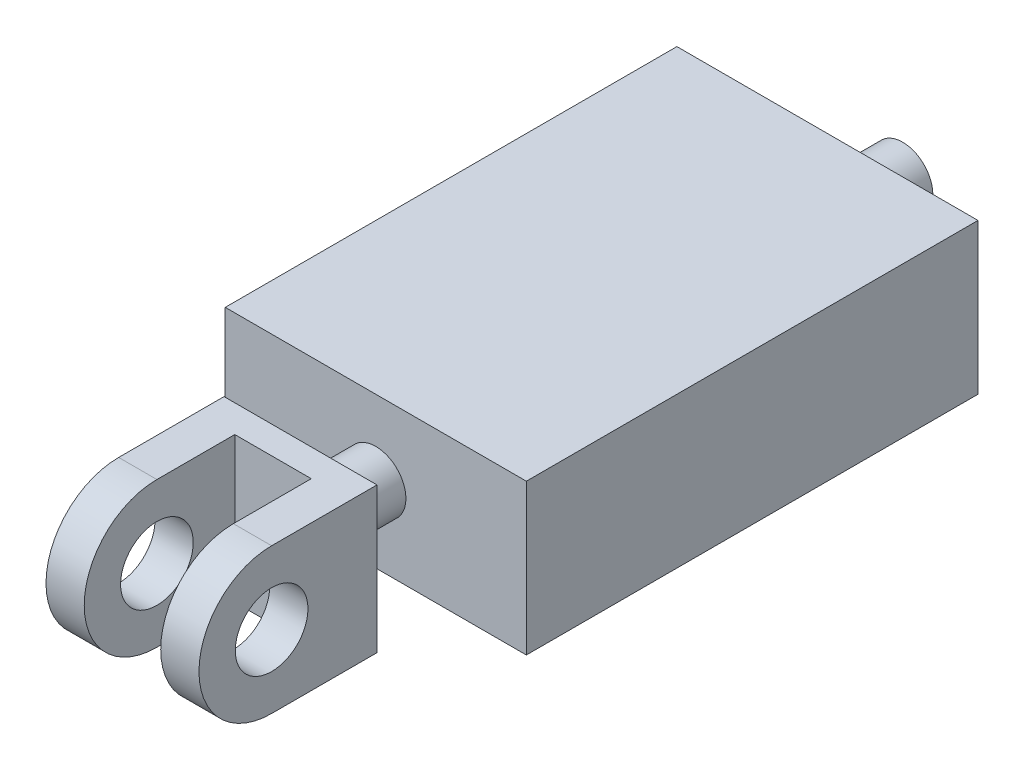
ISO-10303-21;
HEADER;
FILE_DESCRIPTION(('STEP AP214'),'2;1');
FILE_NAME('part.step','',(''),(''),'','','');
FILE_SCHEMA(('AUTOMOTIVE_DESIGN { 1 0 10303 214 1 1 1 1 }'));
ENDSEC;
DATA;
#1=APPLICATION_CONTEXT('core data for automotive mechanical design processes');
#2=APPLICATION_PROTOCOL_DEFINITION('international standard','automotive_design',2000,#1);
#3=PRODUCT_CONTEXT('',#1,'mechanical');
#4=PRODUCT('Part','Part','',(#3));
#5=PRODUCT_RELATED_PRODUCT_CATEGORY('part','',(#4));
#6=PRODUCT_DEFINITION_FORMATION('','',#4);
#7=PRODUCT_DEFINITION_CONTEXT('part definition',#1,'design');
#8=PRODUCT_DEFINITION('design','',#6,#7);
#9=PRODUCT_DEFINITION_SHAPE('','',#8);
#10=(LENGTH_UNIT() NAMED_UNIT(*) SI_UNIT(.MILLI.,.METRE.));
#11=(NAMED_UNIT(*) PLANE_ANGLE_UNIT() SI_UNIT($,.RADIAN.));
#12=(NAMED_UNIT(*) SI_UNIT($,.STERADIAN.) SOLID_ANGLE_UNIT());
#13=UNCERTAINTY_MEASURE_WITH_UNIT(LENGTH_MEASURE(1.E-05),#10,'distance_accuracy_value','');
#14=(GEOMETRIC_REPRESENTATION_CONTEXT(3) GLOBAL_UNCERTAINTY_ASSIGNED_CONTEXT((#13)) GLOBAL_UNIT_ASSIGNED_CONTEXT((#10,
#11,#12)) REPRESENTATION_CONTEXT('',''));
#15=CARTESIAN_POINT('',(0.,0.,0.));
#16=DIRECTION('',(0.,0.,1.));
#17=DIRECTION('',(1.,0.,0.));
#18=AXIS2_PLACEMENT_3D('',#15,#16,#17);
#19=CARTESIAN_POINT('',(-5.08,5.,27.));
#20=DIRECTION('',(1.,0.,0.));
#21=DIRECTION('',(0.,0.,-1.));
#22=AXIS2_PLACEMENT_3D('',#19,#20,#21);
#23=CYLINDRICAL_SURFACE('',#22,4.826);
#24=CARTESIAN_POINT('',(2.54,5.,27.));
#25=DIRECTION('',(1.,0.,0.));
#26=DIRECTION('',(0.,0.,-1.));
#27=AXIS2_PLACEMENT_3D('',#24,#25,#26);
#28=CIRCLE('',#27,4.826);
#29=CARTESIAN_POINT('',(2.54,0.173999999999997,27.));
#30=VERTEX_POINT('',#29);
#31=CARTESIAN_POINT('',(2.54,9.82600000000003,27.));
#32=VERTEX_POINT('',#31);
#33=EDGE_CURVE('E185',#30,#32,#28,.F.);
#34=ORIENTED_EDGE('',*,*,#33,.F.);
#35=DIRECTION('',(1.,0.,0.));
#36=VECTOR('',#35,1.);
#37=CARTESIAN_POINT('',(-5.08,0.173999999999997,27.));
#38=LINE('',#37,#36);
#39=CARTESIAN_POINT('',(5.08,0.173999999999997,27.));
#40=VERTEX_POINT('',#39);
#41=EDGE_CURVE('E227',#30,#40,#38,.T.);
#42=ORIENTED_EDGE('',*,*,#41,.T.);
#43=CARTESIAN_POINT('',(5.08,5.,27.));
#44=DIRECTION('',(1.,0.,0.));
#45=DIRECTION('',(0.,0.,-1.));
#46=AXIS2_PLACEMENT_3D('',#43,#44,#45);
#47=CIRCLE('',#46,4.826);
#48=CARTESIAN_POINT('',(5.08,9.826,27.));
#49=VERTEX_POINT('',#48);
#50=EDGE_CURVE('E192',#49,#40,#47,.T.);
#51=ORIENTED_EDGE('',*,*,#50,.F.);
#52=DIRECTION('',(1.,0.,0.));
#53=VECTOR('',#52,1.);
#54=CARTESIAN_POINT('',(-5.08,9.826,27.));
#55=LINE('',#54,#53);
#56=EDGE_CURVE('E231',#32,#49,#55,.T.);
#57=ORIENTED_EDGE('',*,*,#56,.F.);
#58=EDGE_LOOP('',(#34,#42,#51,#57));
#59=FACE_BOUND('',#58,.T.);
#60=ADVANCED_FACE('F45',(#59),#23,.T.);
#61=CARTESIAN_POINT('',(-5.08,5.,27.));
#62=DIRECTION('',(1.,0.,0.));
#63=DIRECTION('',(0.,0.,-1.));
#64=AXIS2_PLACEMENT_3D('',#61,#62,#63);
#65=CYLINDRICAL_SURFACE('',#64,2.413);
#66=CARTESIAN_POINT('',(2.54,5.,27.));
#67=DIRECTION('',(1.,0.,0.));
#68=DIRECTION('',(0.,0.,-1.));
#69=AXIS2_PLACEMENT_3D('',#66,#67,#68);
#70=CIRCLE('',#69,2.413);
#71=CARTESIAN_POINT('',(2.54,5.,24.587));
#72=VERTEX_POINT('',#71);
#73=EDGE_CURVE('E180',#72,#72,#70,.F.);
#74=ORIENTED_EDGE('',*,*,#73,.T.);
#75=EDGE_LOOP('',(#74));
#76=FACE_BOUND('',#75,.T.);
#77=CARTESIAN_POINT('',(5.08,5.,27.));
#78=DIRECTION('',(1.,0.,0.));
#79=DIRECTION('',(0.,0.,-1.));
#80=AXIS2_PLACEMENT_3D('',#77,#78,#79);
#81=CIRCLE('',#80,2.413);
#82=CARTESIAN_POINT('',(5.08,5.,24.587));
#83=VERTEX_POINT('',#82);
#84=EDGE_CURVE('E188',#83,#83,#81,.T.);
#85=ORIENTED_EDGE('',*,*,#84,.T.);
#86=EDGE_LOOP('',(#85));
#87=FACE_BOUND('',#86,.T.);
#88=ADVANCED_FACE('F297',(#76,#87),#65,.F.);
#89=CARTESIAN_POINT('',(-10.,10.,15.));
#90=DIRECTION('',(1.,0.,0.));
#91=DIRECTION('',(0.,0.,-1.));
#92=AXIS2_PLACEMENT_3D('',#89,#90,#91);
#93=PLANE('',#92);
#94=DIRECTION('',(0.,0.,1.));
#95=VECTOR('',#94,1.);
#96=CARTESIAN_POINT('',(-10.,0.,15.));
#97=LINE('',#96,#95);
#98=CARTESIAN_POINT('',(-10.,0.,-15.));
#99=VERTEX_POINT('',#98);
#100=CARTESIAN_POINT('',(-10.,0.,15.));
#101=VERTEX_POINT('',#100);
#102=EDGE_CURVE('E254',#99,#101,#97,.T.);
#103=ORIENTED_EDGE('',*,*,#102,.T.);
#104=DIRECTION('',(0.,-1.,0.));
#105=VECTOR('',#104,1.);
#106=CARTESIAN_POINT('',(-10.,10.,15.));
#107=LINE('',#106,#105);
#108=CARTESIAN_POINT('',(-10.,10.,15.));
#109=VERTEX_POINT('',#108);
#110=EDGE_CURVE('E54',#109,#101,#107,.T.);
#111=ORIENTED_EDGE('',*,*,#110,.F.);
#112=DIRECTION('',(0.,0.,1.));
#113=VECTOR('',#112,1.);
#114=CARTESIAN_POINT('',(-10.,10.,15.));
#115=LINE('',#114,#113);
#116=CARTESIAN_POINT('',(-10.,10.,-15.));
#117=VERTEX_POINT('',#116);
#118=EDGE_CURVE('E255',#117,#109,#115,.T.);
#119=ORIENTED_EDGE('',*,*,#118,.F.);
#120=DIRECTION('',(0.,-1.,0.));
#121=VECTOR('',#120,1.);
#122=CARTESIAN_POINT('',(-10.,10.,-15.));
#123=LINE('',#122,#121);
#124=EDGE_CURVE('E265',#117,#99,#123,.T.);
#125=ORIENTED_EDGE('',*,*,#124,.T.);
#126=EDGE_LOOP('',(#103,#111,#119,#125));
#127=FACE_BOUND('',#126,.T.);
#128=ADVANCED_FACE('F47',(#127),#93,.F.);
#129=CARTESIAN_POINT('',(-10.,10.,15.));
#130=DIRECTION('',(0.,0.,-1.));
#131=DIRECTION('',(-1.,0.,0.));
#132=AXIS2_PLACEMENT_3D('',#129,#130,#131);
#133=PLANE('',#132);
#134=CARTESIAN_POINT('',(0.,5.,15.));
#135=DIRECTION('',(0.,0.,-1.));
#136=DIRECTION('',(-1.,0.,0.));
#137=AXIS2_PLACEMENT_3D('',#134,#135,#136);
#138=CIRCLE('',#137,2.);
#139=CARTESIAN_POINT('',(-2.,5.,15.));
#140=VERTEX_POINT('',#139);
#141=EDGE_CURVE('E250',#140,#140,#138,.T.);
#142=ORIENTED_EDGE('',*,*,#141,.T.);
#143=EDGE_LOOP('',(#142));
#144=FACE_BOUND('',#143,.T.);
#145=DIRECTION('',(1.,0.,0.));
#146=VECTOR('',#145,1.);
#147=CARTESIAN_POINT('',(-10.,0.,15.));
#148=LINE('',#147,#146);
#149=CARTESIAN_POINT('',(10.,0.,15.));
#150=VERTEX_POINT('',#149);
#151=EDGE_CURVE('E269',#101,#150,#148,.T.);
#152=ORIENTED_EDGE('',*,*,#151,.T.);
#153=DIRECTION('',(0.,-1.,0.));
#154=VECTOR('',#153,1.);
#155=CARTESIAN_POINT('',(10.,10.,15.));
#156=LINE('',#155,#154);
#157=CARTESIAN_POINT('',(10.,10.,15.));
#158=VERTEX_POINT('',#157);
#159=EDGE_CURVE('E282',#158,#150,#156,.T.);
#160=ORIENTED_EDGE('',*,*,#159,.F.);
#161=DIRECTION('',(1.,0.,0.));
#162=VECTOR('',#161,1.);
#163=CARTESIAN_POINT('',(-10.,10.,15.));
#164=LINE('',#163,#162);
#165=EDGE_CURVE('E99',#109,#158,#164,.T.);
#166=ORIENTED_EDGE('',*,*,#165,.F.);
#167=ORIENTED_EDGE('',*,*,#110,.T.);
#168=EDGE_LOOP('',(#152,#160,#166,#167));
#169=FACE_BOUND('',#168,.T.);
#170=ADVANCED_FACE('F490',(#144,#169),#133,.F.);
#171=CARTESIAN_POINT('',(10.,10.,15.));
#172=DIRECTION('',(-1.,0.,0.));
#173=DIRECTION('',(0.,0.,1.));
#174=AXIS2_PLACEMENT_3D('',#171,#172,#173);
#175=PLANE('',#174);
#176=DIRECTION('',(0.,0.,-1.));
#177=VECTOR('',#176,1.);
#178=CARTESIAN_POINT('',(10.,0.,15.));
#179=LINE('',#178,#177);
#180=CARTESIAN_POINT('',(10.,0.,-15.));
#181=VERTEX_POINT('',#180);
#182=EDGE_CURVE('E272',#150,#181,#179,.T.);
#183=ORIENTED_EDGE('',*,*,#182,.T.);
#184=DIRECTION('',(0.,-1.,0.));
#185=VECTOR('',#184,1.);
#186=CARTESIAN_POINT('',(10.,10.,-15.));
#187=LINE('',#186,#185);
#188=CARTESIAN_POINT('',(10.,10.,-15.));
#189=VERTEX_POINT('',#188);
#190=EDGE_CURVE('E279',#189,#181,#187,.T.);
#191=ORIENTED_EDGE('',*,*,#190,.F.);
#192=DIRECTION('',(0.,0.,-1.));
#193=VECTOR('',#192,1.);
#194=CARTESIAN_POINT('',(10.,10.,15.));
#195=LINE('',#194,#193);
#196=EDGE_CURVE('E260',#158,#189,#195,.T.);
#197=ORIENTED_EDGE('',*,*,#196,.F.);
#198=ORIENTED_EDGE('',*,*,#159,.T.);
#199=EDGE_LOOP('',(#183,#191,#197,#198));
#200=FACE_BOUND('',#199,.T.);
#201=ADVANCED_FACE('F481',(#200),#175,.F.);
#202=CARTESIAN_POINT('',(-10.,10.,-15.));
#203=DIRECTION('',(0.,0.,1.));
#204=DIRECTION('',(1.,0.,0.));
#205=AXIS2_PLACEMENT_3D('',#202,#203,#204);
#206=PLANE('',#205);
#207=CARTESIAN_POINT('',(0.,5.,-15.));
#208=DIRECTION('',(0.,0.,1.));
#209=DIRECTION('',(1.,0.,0.));
#210=AXIS2_PLACEMENT_3D('',#207,#208,#209);
#211=CIRCLE('',#210,2.);
#212=CARTESIAN_POINT('',(2.,5.,-15.));
#213=VERTEX_POINT('',#212);
#214=EDGE_CURVE('E249',#213,#213,#211,.T.);
#215=ORIENTED_EDGE('',*,*,#214,.T.);
#216=EDGE_LOOP('',(#215));
#217=FACE_BOUND('',#216,.T.);
#218=DIRECTION('',(-1.,0.,0.));
#219=VECTOR('',#218,1.);
#220=CARTESIAN_POINT('',(-10.,0.,-15.));
#221=LINE('',#220,#219);
#222=EDGE_CURVE('E91',#181,#99,#221,.T.);
#223=ORIENTED_EDGE('',*,*,#222,.T.);
#224=ORIENTED_EDGE('',*,*,#124,.F.);
#225=DIRECTION('',(-1.,0.,0.));
#226=VECTOR('',#225,1.);
#227=CARTESIAN_POINT('',(-10.,10.,-15.));
#228=LINE('',#227,#226);
#229=EDGE_CURVE('E70',#189,#117,#228,.T.);
#230=ORIENTED_EDGE('',*,*,#229,.F.);
#231=ORIENTED_EDGE('',*,*,#190,.T.);
#232=EDGE_LOOP('',(#223,#224,#230,#231));
#233=FACE_BOUND('',#232,.T.);
#234=ADVANCED_FACE('F472',(#217,#233),#206,.F.);
#235=CARTESIAN_POINT('',(0.,10.,0.));
#236=DIRECTION('',(0.,-1.,0.));
#237=DIRECTION('',(0.,0.,-1.));
#238=AXIS2_PLACEMENT_3D('',#235,#236,#237);
#239=PLANE('',#238);
#240=ORIENTED_EDGE('',*,*,#118,.T.);
#241=ORIENTED_EDGE('',*,*,#165,.T.);
#242=ORIENTED_EDGE('',*,*,#196,.T.);
#243=ORIENTED_EDGE('',*,*,#229,.T.);
#244=EDGE_LOOP('',(#240,#241,#242,#243));
#245=FACE_BOUND('',#244,.T.);
#246=ADVANCED_FACE('F461',(#245),#239,.F.);
#247=CARTESIAN_POINT('',(0.,0.,0.));
#248=DIRECTION('',(0.,-1.,0.));
#249=DIRECTION('',(0.,0.,-1.));
#250=AXIS2_PLACEMENT_3D('',#247,#248,#249);
#251=PLANE('',#250);
#252=ORIENTED_EDGE('',*,*,#102,.F.);
#253=ORIENTED_EDGE('',*,*,#222,.F.);
#254=ORIENTED_EDGE('',*,*,#182,.F.);
#255=ORIENTED_EDGE('',*,*,#151,.F.);
#256=EDGE_LOOP('',(#252,#253,#254,#255));
#257=FACE_BOUND('',#256,.T.);
#258=ADVANCED_FACE('F451',(#257),#251,.T.);
#259=CARTESIAN_POINT('',(0.,5.,-20.));
#260=DIRECTION('',(0.,0.,1.));
#261=DIRECTION('',(1.,0.,0.));
#262=AXIS2_PLACEMENT_3D('',#259,#260,#261);
#263=PLANE('',#262);
#264=CARTESIAN_POINT('',(0.,5.,-20.));
#265=DIRECTION('',(0.,0.,1.));
#266=DIRECTION('',(1.,0.,0.));
#267=AXIS2_PLACEMENT_3D('',#264,#265,#266);
#268=CIRCLE('',#267,2.);
#269=CARTESIAN_POINT('',(2.,5.,-20.));
#270=VERTEX_POINT('',#269);
#271=EDGE_CURVE('E245',#270,#270,#268,.T.);
#272=ORIENTED_EDGE('',*,*,#271,.F.);
#273=EDGE_LOOP('',(#272));
#274=FACE_BOUND('',#273,.T.);
#275=ADVANCED_FACE('F442',(#274),#263,.F.);
#276=CARTESIAN_POINT('',(0.,5.,-20.));
#277=DIRECTION('',(0.,0.,1.));
#278=DIRECTION('',(1.,0.,0.));
#279=AXIS2_PLACEMENT_3D('',#276,#277,#278);
#280=CYLINDRICAL_SURFACE('',#279,2.);
#281=ORIENTED_EDGE('',*,*,#271,.T.);
#282=EDGE_LOOP('',(#281));
#283=FACE_BOUND('',#282,.T.);
#284=ORIENTED_EDGE('',*,*,#214,.F.);
#285=EDGE_LOOP('',(#284));
#286=FACE_BOUND('',#285,.T.);
#287=ADVANCED_FACE('F333',(#283,#286),#280,.T.);
#288=CARTESIAN_POINT('',(0.,5.,20.));
#289=DIRECTION('',(0.,0.,1.));
#290=DIRECTION('',(1.,0.,0.));
#291=AXIS2_PLACEMENT_3D('',#288,#289,#290);
#292=CIRCLE('',#291,2.);
#293=CARTESIAN_POINT('',(2.,5.,20.));
#294=VERTEX_POINT('',#293);
#295=EDGE_CURVE('E230',#294,#294,#292,.T.);
#296=ORIENTED_EDGE('',*,*,#295,.F.);
#297=EDGE_LOOP('',(#296));
#298=FACE_BOUND('',#297,.T.);
#299=ORIENTED_EDGE('',*,*,#141,.F.);
#300=EDGE_LOOP('',(#299));
#301=FACE_BOUND('',#300,.T.);
#302=ADVANCED_FACE('F325',(#298,#301),#280,.T.);
#303=CARTESIAN_POINT('',(-5.08,0.173999999999997,27.));
#304=VERTEX_POINT('',#303);
#305=CARTESIAN_POINT('',(-2.54,0.173999999999997,27.));
#306=VERTEX_POINT('',#305);
#307=EDGE_CURVE('E238',#304,#306,#38,.T.);
#308=ORIENTED_EDGE('',*,*,#307,.T.);
#309=CARTESIAN_POINT('',(-2.54,5.,27.));
#310=DIRECTION('',(-1.,0.,0.));
#311=DIRECTION('',(0.,0.,1.));
#312=AXIS2_PLACEMENT_3D('',#309,#310,#311);
#313=CIRCLE('',#312,4.826);
#314=CARTESIAN_POINT('',(-2.54,9.82600000000003,27.));
#315=VERTEX_POINT('',#314);
#316=EDGE_CURVE('E61',#315,#306,#313,.F.);
#317=ORIENTED_EDGE('',*,*,#316,.F.);
#318=CARTESIAN_POINT('',(-5.08,9.826,27.));
#319=VERTEX_POINT('',#318);
#320=EDGE_CURVE('E167',#319,#315,#55,.T.);
#321=ORIENTED_EDGE('',*,*,#320,.F.);
#322=CARTESIAN_POINT('',(-5.08,5.,27.));
#323=DIRECTION('',(1.,0.,0.));
#324=DIRECTION('',(0.,0.,-1.));
#325=AXIS2_PLACEMENT_3D('',#322,#323,#324);
#326=CIRCLE('',#325,4.826);
#327=EDGE_CURVE('E212',#319,#304,#326,.T.);
#328=ORIENTED_EDGE('',*,*,#327,.T.);
#329=EDGE_LOOP('',(#308,#317,#321,#328));
#330=FACE_BOUND('',#329,.T.);
#331=ADVANCED_FACE('F317',(#330),#23,.T.);
#332=CARTESIAN_POINT('',(-5.08,9.826,27.));
#333=DIRECTION('',(0.,1.,0.));
#334=DIRECTION('',(0.,0.,1.));
#335=AXIS2_PLACEMENT_3D('',#332,#333,#334);
#336=PLANE('',#335);
#337=DIRECTION('',(0.,0.,-1.));
#338=VECTOR('',#337,1.);
#339=CARTESIAN_POINT('',(2.54,9.82600000000003,31.826));
#340=LINE('',#339,#338);
#341=CARTESIAN_POINT('',(2.54,9.82600000000002,21.826));
#342=VERTEX_POINT('',#341);
#343=EDGE_CURVE('E153',#32,#342,#340,.T.);
#344=ORIENTED_EDGE('',*,*,#343,.F.);
#345=ORIENTED_EDGE('',*,*,#56,.T.);
#346=DIRECTION('',(0.,0.,1.));
#347=VECTOR('',#346,1.);
#348=CARTESIAN_POINT('',(5.08,9.826,27.));
#349=LINE('',#348,#347);
#350=CARTESIAN_POINT('',(5.08,9.826,20.));
#351=VERTEX_POINT('',#350);
#352=EDGE_CURVE('E204',#351,#49,#349,.T.);
#353=ORIENTED_EDGE('',*,*,#352,.F.);
#354=DIRECTION('',(1.,0.,0.));
#355=VECTOR('',#354,1.);
#356=CARTESIAN_POINT('',(-5.08,9.826,20.));
#357=LINE('',#356,#355);
#358=CARTESIAN_POINT('',(-5.08,9.826,20.));
#359=VERTEX_POINT('',#358);
#360=EDGE_CURVE('E232',#359,#351,#357,.T.);
#361=ORIENTED_EDGE('',*,*,#360,.F.);
#362=DIRECTION('',(0.,0.,1.));
#363=VECTOR('',#362,1.);
#364=CARTESIAN_POINT('',(-5.08,9.826,27.));
#365=LINE('',#364,#363);
#366=EDGE_CURVE('E224',#359,#319,#365,.T.);
#367=ORIENTED_EDGE('',*,*,#366,.T.);
#368=ORIENTED_EDGE('',*,*,#320,.T.);
#369=DIRECTION('',(0.,0.,1.));
#370=VECTOR('',#369,1.);
#371=CARTESIAN_POINT('',(-2.54,9.82600000000002,21.826));
#372=LINE('',#371,#370);
#373=CARTESIAN_POINT('',(-2.54,9.82600000000002,21.826));
#374=VERTEX_POINT('',#373);
#375=EDGE_CURVE('E147',#374,#315,#372,.T.);
#376=ORIENTED_EDGE('',*,*,#375,.F.);
#377=DIRECTION('',(-1.,0.,0.));
#378=VECTOR('',#377,1.);
#379=CARTESIAN_POINT('',(-2.54,9.82600000000002,21.826));
#380=LINE('',#379,#378);
#381=EDGE_CURVE('E156',#342,#374,#380,.T.);
#382=ORIENTED_EDGE('',*,*,#381,.F.);
#383=EDGE_LOOP('',(#344,#345,#353,#361,#367,#368,#376,#382));
#384=FACE_BOUND('',#383,.T.);
#385=ADVANCED_FACE('F165',(#384),#336,.T.);
#386=CARTESIAN_POINT('',(-5.08,9.826,20.));
#387=DIRECTION('',(0.,0.,-1.));
#388=DIRECTION('',(-1.,0.,0.));
#389=AXIS2_PLACEMENT_3D('',#386,#387,#388);
#390=PLANE('',#389);
#391=ORIENTED_EDGE('',*,*,#295,.T.);
#392=EDGE_LOOP('',(#391));
#393=FACE_BOUND('',#392,.T.);
#394=ORIENTED_EDGE('',*,*,#360,.T.);
#395=DIRECTION('',(0.,1.,0.));
#396=VECTOR('',#395,1.);
#397=CARTESIAN_POINT('',(5.08,9.826,20.));
#398=LINE('',#397,#396);
#399=CARTESIAN_POINT('',(5.08,0.173999999999997,20.));
#400=VERTEX_POINT('',#399);
#401=EDGE_CURVE('E200',#400,#351,#398,.T.);
#402=ORIENTED_EDGE('',*,*,#401,.F.);
#403=DIRECTION('',(1.,0.,0.));
#404=VECTOR('',#403,1.);
#405=CARTESIAN_POINT('',(-5.08,0.173999999999997,20.));
#406=LINE('',#405,#404);
#407=CARTESIAN_POINT('',(-5.08,0.173999999999997,20.));
#408=VERTEX_POINT('',#407);
#409=EDGE_CURVE('E235',#408,#400,#406,.T.);
#410=ORIENTED_EDGE('',*,*,#409,.F.);
#411=DIRECTION('',(0.,1.,0.));
#412=VECTOR('',#411,1.);
#413=CARTESIAN_POINT('',(-5.08,9.826,20.));
#414=LINE('',#413,#412);
#415=EDGE_CURVE('E220',#408,#359,#414,.T.);
#416=ORIENTED_EDGE('',*,*,#415,.T.);
#417=EDGE_LOOP('',(#394,#402,#410,#416));
#418=FACE_BOUND('',#417,.T.);
#419=ADVANCED_FACE('F330',(#393,#418),#390,.T.);
#420=CARTESIAN_POINT('',(-5.08,0.173999999999997,20.));
#421=DIRECTION('',(0.,-1.,0.));
#422=DIRECTION('',(0.,0.,-1.));
#423=AXIS2_PLACEMENT_3D('',#420,#421,#422);
#424=PLANE('',#423);
#425=DIRECTION('',(0.,0.,1.));
#426=VECTOR('',#425,1.);
#427=CARTESIAN_POINT('',(2.54,0.173999999999997,20.));
#428=LINE('',#427,#426);
#429=CARTESIAN_POINT('',(2.54,0.173999999999997,21.826));
#430=VERTEX_POINT('',#429);
#431=EDGE_CURVE('E181',#430,#30,#428,.T.);
#432=ORIENTED_EDGE('',*,*,#431,.F.);
#433=DIRECTION('',(1.,0.,0.));
#434=VECTOR('',#433,1.);
#435=CARTESIAN_POINT('',(-5.08,0.173999999999997,21.826));
#436=LINE('',#435,#434);
#437=CARTESIAN_POINT('',(-2.54,0.173999999999997,21.826));
#438=VERTEX_POINT('',#437);
#439=EDGE_CURVE('E11',#438,#430,#436,.T.);
#440=ORIENTED_EDGE('',*,*,#439,.F.);
#441=DIRECTION('',(0.,0.,-1.));
#442=VECTOR('',#441,1.);
#443=CARTESIAN_POINT('',(-2.54,0.173999999999997,20.));
#444=LINE('',#443,#442);
#445=EDGE_CURVE('E148',#306,#438,#444,.T.);
#446=ORIENTED_EDGE('',*,*,#445,.F.);
#447=ORIENTED_EDGE('',*,*,#307,.F.);
#448=DIRECTION('',(0.,0.,-1.));
#449=VECTOR('',#448,1.);
#450=CARTESIAN_POINT('',(-5.08,0.173999999999997,20.));
#451=LINE('',#450,#449);
#452=EDGE_CURVE('E216',#304,#408,#451,.T.);
#453=ORIENTED_EDGE('',*,*,#452,.T.);
#454=ORIENTED_EDGE('',*,*,#409,.T.);
#455=DIRECTION('',(0.,0.,-1.));
#456=VECTOR('',#455,1.);
#457=CARTESIAN_POINT('',(5.08,0.173999999999997,20.));
#458=LINE('',#457,#456);
#459=EDGE_CURVE('E196',#40,#400,#458,.T.);
#460=ORIENTED_EDGE('',*,*,#459,.F.);
#461=ORIENTED_EDGE('',*,*,#41,.F.);
#462=EDGE_LOOP('',(#432,#440,#446,#447,#453,#454,#460,#461));
#463=FACE_BOUND('',#462,.T.);
#464=ADVANCED_FACE('F340',(#463),#424,.T.);
#465=CARTESIAN_POINT('',(-5.08,5.,27.));
#466=DIRECTION('',(1.,0.,0.));
#467=DIRECTION('',(0.,0.,-1.));
#468=AXIS2_PLACEMENT_3D('',#465,#466,#467);
#469=PLANE('',#468);
#470=CARTESIAN_POINT('',(-5.08,5.,27.));
#471=DIRECTION('',(1.,0.,0.));
#472=DIRECTION('',(0.,0.,-1.));
#473=AXIS2_PLACEMENT_3D('',#470,#471,#472);
#474=CIRCLE('',#473,2.413);
#475=CARTESIAN_POINT('',(-5.08,5.,24.587));
#476=VERTEX_POINT('',#475);
#477=EDGE_CURVE('E208',#476,#476,#474,.T.);
#478=ORIENTED_EDGE('',*,*,#477,.T.);
#479=EDGE_LOOP('',(#478));
#480=FACE_BOUND('',#479,.T.);
#481=ORIENTED_EDGE('',*,*,#327,.F.);
#482=ORIENTED_EDGE('',*,*,#366,.F.);
#483=ORIENTED_EDGE('',*,*,#415,.F.);
#484=ORIENTED_EDGE('',*,*,#452,.F.);
#485=EDGE_LOOP('',(#481,#482,#483,#484));
#486=FACE_BOUND('',#485,.T.);
#487=ADVANCED_FACE('F343',(#480,#486),#469,.F.);
#488=CARTESIAN_POINT('',(-2.54,5.,27.));
#489=DIRECTION('',(-1.,0.,0.));
#490=DIRECTION('',(0.,0.,1.));
#491=AXIS2_PLACEMENT_3D('',#488,#489,#490);
#492=CIRCLE('',#491,2.413);
#493=CARTESIAN_POINT('',(-2.54,5.,29.413));
#494=VERTEX_POINT('',#493);
#495=EDGE_CURVE('E174',#494,#494,#492,.F.);
#496=ORIENTED_EDGE('',*,*,#495,.T.);
#497=EDGE_LOOP('',(#496));
#498=FACE_BOUND('',#497,.T.);
#499=ORIENTED_EDGE('',*,*,#477,.F.);
#500=EDGE_LOOP('',(#499));
#501=FACE_BOUND('',#500,.T.);
#502=ADVANCED_FACE('F311',(#498,#501),#65,.F.);
#503=CARTESIAN_POINT('',(5.08,5.,27.));
#504=DIRECTION('',(1.,0.,0.));
#505=DIRECTION('',(0.,0.,-1.));
#506=AXIS2_PLACEMENT_3D('',#503,#504,#505);
#507=PLANE('',#506);
#508=ORIENTED_EDGE('',*,*,#50,.T.);
#509=ORIENTED_EDGE('',*,*,#459,.T.);
#510=ORIENTED_EDGE('',*,*,#401,.T.);
#511=ORIENTED_EDGE('',*,*,#352,.T.);
#512=EDGE_LOOP('',(#508,#509,#510,#511));
#513=FACE_BOUND('',#512,.T.);
#514=ORIENTED_EDGE('',*,*,#84,.F.);
#515=EDGE_LOOP('',(#514));
#516=FACE_BOUND('',#515,.T.);
#517=ADVANCED_FACE('F302',(#513,#516),#507,.T.);
#518=CARTESIAN_POINT('',(2.54,0.,31.826));
#519=DIRECTION('',(1.,0.,0.));
#520=DIRECTION('',(0.,0.,-1.));
#521=AXIS2_PLACEMENT_3D('',#518,#519,#520);
#522=PLANE('',#521);
#523=ORIENTED_EDGE('',*,*,#33,.T.);
#524=ORIENTED_EDGE('',*,*,#343,.T.);
#525=DIRECTION('',(0.,1.,0.));
#526=VECTOR('',#525,1.);
#527=CARTESIAN_POINT('',(2.54,0.,21.826));
#528=LINE('',#527,#526);
#529=EDGE_CURVE('E152',#430,#342,#528,.T.);
#530=ORIENTED_EDGE('',*,*,#529,.F.);
#531=ORIENTED_EDGE('',*,*,#431,.T.);
#532=EDGE_LOOP('',(#523,#524,#530,#531));
#533=FACE_BOUND('',#532,.T.);
#534=ORIENTED_EDGE('',*,*,#73,.F.);
#535=EDGE_LOOP('',(#534));
#536=FACE_BOUND('',#535,.T.);
#537=ADVANCED_FACE('F300',(#533,#536),#522,.F.);
#538=CARTESIAN_POINT('',(-2.54,0.,21.826));
#539=DIRECTION('',(-1.,0.,0.));
#540=DIRECTION('',(0.,0.,1.));
#541=AXIS2_PLACEMENT_3D('',#538,#539,#540);
#542=PLANE('',#541);
#543=ORIENTED_EDGE('',*,*,#316,.T.);
#544=ORIENTED_EDGE('',*,*,#445,.T.);
#545=DIRECTION('',(0.,1.,0.));
#546=VECTOR('',#545,1.);
#547=CARTESIAN_POINT('',(-2.54,0.,21.826));
#548=LINE('',#547,#546);
#549=EDGE_CURVE('E142',#438,#374,#548,.T.);
#550=ORIENTED_EDGE('',*,*,#549,.T.);
#551=ORIENTED_EDGE('',*,*,#375,.T.);
#552=EDGE_LOOP('',(#543,#544,#550,#551));
#553=FACE_BOUND('',#552,.T.);
#554=ORIENTED_EDGE('',*,*,#495,.F.);
#555=EDGE_LOOP('',(#554));
#556=FACE_BOUND('',#555,.T.);
#557=ADVANCED_FACE('F144',(#553,#556),#542,.F.);
#558=CARTESIAN_POINT('',(-2.54,0.,21.826));
#559=DIRECTION('',(0.,0.,-1.));
#560=DIRECTION('',(0.,1.,0.));
#561=AXIS2_PLACEMENT_3D('',#558,#559,#560);
#562=PLANE('',#561);
#563=ORIENTED_EDGE('',*,*,#439,.T.);
#564=ORIENTED_EDGE('',*,*,#529,.T.);
#565=ORIENTED_EDGE('',*,*,#381,.T.);
#566=ORIENTED_EDGE('',*,*,#549,.F.);
#567=EDGE_LOOP('',(#563,#564,#565,#566));
#568=FACE_BOUND('',#567,.T.);
#569=ADVANCED_FACE('F157',(#568),#562,.F.);
#570=CLOSED_SHELL('',(#60,#88,#128,#170,#201,#234,#246,#258,#275,#287,#302,#331,#385,#419,#464,
#487,#502,#517,#537,#557,#569));
#571=MANIFOLD_SOLID_BREP('B2',#570);
#572=ADVANCED_BREP_SHAPE_REPRESENTATION('',(#18,#571),#14);
#573=SHAPE_DEFINITION_REPRESENTATION(#9,#572);
ENDSEC;
END-ISO-10303-21;
